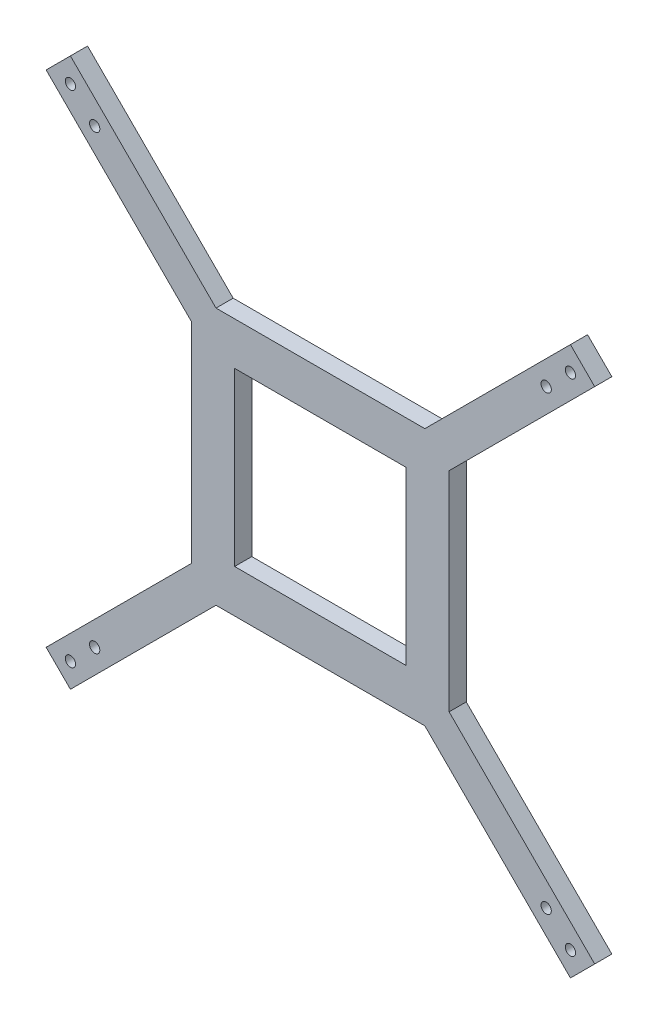
ISO-10303-21;
HEADER;
FILE_DESCRIPTION(('STEP AP214'),'2;1');
FILE_NAME('part.step','',(''),(''),'','','');
FILE_SCHEMA(('AUTOMOTIVE_DESIGN { 1 0 10303 214 1 1 1 1 }'));
ENDSEC;
DATA;
#1=APPLICATION_CONTEXT('core data for automotive mechanical design processes');
#2=APPLICATION_PROTOCOL_DEFINITION('international standard','automotive_design',2000,#1);
#3=PRODUCT_CONTEXT('',#1,'mechanical');
#4=PRODUCT('Part','Part','',(#3));
#5=PRODUCT_RELATED_PRODUCT_CATEGORY('part','',(#4));
#6=PRODUCT_DEFINITION_FORMATION('','',#4);
#7=PRODUCT_DEFINITION_CONTEXT('part definition',#1,'design');
#8=PRODUCT_DEFINITION('design','',#6,#7);
#9=PRODUCT_DEFINITION_SHAPE('','',#8);
#10=(LENGTH_UNIT() NAMED_UNIT(*) SI_UNIT(.MILLI.,.METRE.));
#11=(NAMED_UNIT(*) PLANE_ANGLE_UNIT() SI_UNIT($,.RADIAN.));
#12=(NAMED_UNIT(*) SI_UNIT($,.STERADIAN.) SOLID_ANGLE_UNIT());
#13=UNCERTAINTY_MEASURE_WITH_UNIT(LENGTH_MEASURE(1.E-05),#10,'distance_accuracy_value','');
#14=(GEOMETRIC_REPRESENTATION_CONTEXT(3) GLOBAL_UNCERTAINTY_ASSIGNED_CONTEXT((#13)) GLOBAL_UNIT_ASSIGNED_CONTEXT((#10,
#11,#12)) REPRESENTATION_CONTEXT('',''));
#15=CARTESIAN_POINT('',(0.,0.,0.));
#16=DIRECTION('',(0.,0.,1.));
#17=DIRECTION('',(1.,0.,0.));
#18=AXIS2_PLACEMENT_3D('',#15,#16,#17);
#19=CARTESIAN_POINT('',(0.,0.,5.));
#20=DIRECTION('',(0.,0.,1.));
#21=DIRECTION('',(1.,0.,0.));
#22=AXIS2_PLACEMENT_3D('',#19,#20,#21);
#23=PLANE('',#22);
#24=CARTESIAN_POINT('',(-72.855339059328,-72.8553390593277,5.));
#25=DIRECTION('',(0.,0.,1.));
#26=DIRECTION('',(1.,0.,0.));
#27=AXIS2_PLACEMENT_3D('',#24,#25,#26);
#28=CIRCLE('',#27,1.5);
#29=CARTESIAN_POINT('',(-71.355339059328,-72.8553390593277,5.));
#30=VERTEX_POINT('',#29);
#31=EDGE_CURVE('E668',#30,#30,#28,.T.);
#32=ORIENTED_EDGE('',*,*,#31,.F.);
#33=EDGE_LOOP('',(#32));
#34=FACE_BOUND('',#33,.T.);
#35=CARTESIAN_POINT('',(72.855339059328,-72.8553390593277,5.));
#36=DIRECTION('',(0.,0.,1.));
#37=DIRECTION('',(-1.,0.,0.));
#38=AXIS2_PLACEMENT_3D('',#35,#36,#37);
#39=CIRCLE('',#38,1.5);
#40=CARTESIAN_POINT('',(71.355339059328,-72.8553390593277,5.));
#41=VERTEX_POINT('',#40);
#42=EDGE_CURVE('E680',#41,#41,#39,.T.);
#43=ORIENTED_EDGE('',*,*,#42,.F.);
#44=EDGE_LOOP('',(#43));
#45=FACE_BOUND('',#44,.T.);
#46=CARTESIAN_POINT('',(-65.7842712474625,65.7842712474622,5.));
#47=DIRECTION('',(0.,0.,1.));
#48=DIRECTION('',(-1.,0.,0.));
#49=AXIS2_PLACEMENT_3D('',#46,#47,#48);
#50=CIRCLE('',#49,1.5);
#51=CARTESIAN_POINT('',(-67.2842712474625,65.7842712474622,5.));
#52=VERTEX_POINT('',#51);
#53=EDGE_CURVE('E692',#52,#52,#50,.T.);
#54=ORIENTED_EDGE('',*,*,#53,.F.);
#55=EDGE_LOOP('',(#54));
#56=FACE_BOUND('',#55,.T.);
#57=CARTESIAN_POINT('',(72.855339059328,72.8553390593277,5.));
#58=DIRECTION('',(0.,0.,1.));
#59=DIRECTION('',(1.,0.,0.));
#60=AXIS2_PLACEMENT_3D('',#57,#58,#59);
#61=CIRCLE('',#60,1.5);
#62=CARTESIAN_POINT('',(74.355339059328,72.8553390593277,5.));
#63=VERTEX_POINT('',#62);
#64=EDGE_CURVE('E198',#63,#63,#61,.T.);
#65=ORIENTED_EDGE('',*,*,#64,.F.);
#66=EDGE_LOOP('',(#65));
#67=FACE_BOUND('',#66,.T.);
#68=DIRECTION('',(0.707106781186549,0.707106781186546,0.));
#69=VECTOR('',#68,1.);
#70=CARTESIAN_POINT('',(-72.8553390593272,-79.926406871194,5.));
#71=LINE('',#70,#69);
#72=CARTESIAN_POINT('',(-72.8553390593272,-79.926406871194,5.));
#73=VERTEX_POINT('',#72);
#74=CARTESIAN_POINT('',(-30.4289321881343,-37.5000000000012,5.));
#75=VERTEX_POINT('',#74);
#76=EDGE_CURVE('E208',#73,#75,#71,.T.);
#77=ORIENTED_EDGE('',*,*,#76,.T.);
#78=DIRECTION('',(1.,0.,0.));
#79=VECTOR('',#78,1.);
#80=CARTESIAN_POINT('',(-30.4289321881343,-37.5000000000012,5.));
#81=LINE('',#80,#79);
#82=CARTESIAN_POINT('',(30.4289321881343,-37.5000000000012,5.));
#83=VERTEX_POINT('',#82);
#84=EDGE_CURVE('E211',#75,#83,#81,.T.);
#85=ORIENTED_EDGE('',*,*,#84,.T.);
#86=DIRECTION('',(0.707106781186549,-0.707106781186546,0.));
#87=VECTOR('',#86,1.);
#88=CARTESIAN_POINT('',(72.8553390593272,-79.926406871194,5.));
#89=LINE('',#88,#87);
#90=CARTESIAN_POINT('',(72.8553390593272,-79.926406871194,5.));
#91=VERTEX_POINT('',#90);
#92=EDGE_CURVE('E214',#83,#91,#89,.T.);
#93=ORIENTED_EDGE('',*,*,#92,.T.);
#94=DIRECTION('',(0.707106781186548,0.707106781186548,0.));
#95=VECTOR('',#94,1.);
#96=CARTESIAN_POINT('',(79.9264068711938,-72.8553390593274,5.));
#97=LINE('',#96,#95);
#98=CARTESIAN_POINT('',(79.9264068711938,-72.8553390593274,5.));
#99=VERTEX_POINT('',#98);
#100=EDGE_CURVE('E216',#91,#99,#97,.T.);
#101=ORIENTED_EDGE('',*,*,#100,.T.);
#102=DIRECTION('',(-0.707106781186549,0.707106781186546,0.));
#103=VECTOR('',#102,1.);
#104=CARTESIAN_POINT('',(79.9264068711938,-72.8553390593274,5.));
#105=LINE('',#104,#103);
#106=CARTESIAN_POINT('',(37.5000000000006,-30.4289321881345,5.));
#107=VERTEX_POINT('',#106);
#108=EDGE_CURVE('E218',#99,#107,#105,.T.);
#109=ORIENTED_EDGE('',*,*,#108,.T.);
#110=DIRECTION('',(0.,1.,0.));
#111=VECTOR('',#110,1.);
#112=CARTESIAN_POINT('',(37.5000000000006,30.4289321881345,5.));
#113=LINE('',#112,#111);
#114=CARTESIAN_POINT('',(37.5000000000006,30.4289321881345,5.));
#115=VERTEX_POINT('',#114);
#116=EDGE_CURVE('E220',#107,#115,#113,.T.);
#117=ORIENTED_EDGE('',*,*,#116,.T.);
#118=DIRECTION('',(0.707106781186549,0.707106781186546,0.));
#119=VECTOR('',#118,1.);
#120=CARTESIAN_POINT('',(79.9264068711937,72.8553390593275,5.));
#121=LINE('',#120,#119);
#122=CARTESIAN_POINT('',(79.9264068711937,72.8553390593275,5.));
#123=VERTEX_POINT('',#122);
#124=EDGE_CURVE('E222',#115,#123,#121,.T.);
#125=ORIENTED_EDGE('',*,*,#124,.T.);
#126=DIRECTION('',(-0.707106781186548,0.707106781186548,0.));
#127=VECTOR('',#126,1.);
#128=CARTESIAN_POINT('',(79.9264068711937,72.8553390593275,5.));
#129=LINE('',#128,#127);
#130=CARTESIAN_POINT('',(72.8553390593272,79.926406871194,5.));
#131=VERTEX_POINT('',#130);
#132=EDGE_CURVE('E224',#123,#131,#129,.T.);
#133=ORIENTED_EDGE('',*,*,#132,.T.);
#134=DIRECTION('',(-0.707106781186549,-0.707106781186546,0.));
#135=VECTOR('',#134,1.);
#136=CARTESIAN_POINT('',(72.8553390593272,79.926406871194,5.));
#137=LINE('',#136,#135);
#138=CARTESIAN_POINT('',(30.4289321881343,37.5000000000012,5.));
#139=VERTEX_POINT('',#138);
#140=EDGE_CURVE('E226',#131,#139,#137,.T.);
#141=ORIENTED_EDGE('',*,*,#140,.T.);
#142=DIRECTION('',(-1.,0.,0.));
#143=VECTOR('',#142,1.);
#144=CARTESIAN_POINT('',(-30.4289321881343,37.5000000000012,5.));
#145=LINE('',#144,#143);
#146=CARTESIAN_POINT('',(-30.4289321881343,37.5000000000012,5.));
#147=VERTEX_POINT('',#146);
#148=EDGE_CURVE('E228',#139,#147,#145,.T.);
#149=ORIENTED_EDGE('',*,*,#148,.T.);
#150=DIRECTION('',(-0.707106781186549,0.707106781186546,0.));
#151=VECTOR('',#150,1.);
#152=CARTESIAN_POINT('',(-72.8553390593272,79.926406871194,5.));
#153=LINE('',#152,#151);
#154=CARTESIAN_POINT('',(-72.8553390593272,79.926406871194,5.));
#155=VERTEX_POINT('',#154);
#156=EDGE_CURVE('E230',#147,#155,#153,.T.);
#157=ORIENTED_EDGE('',*,*,#156,.T.);
#158=DIRECTION('',(-0.707106781186548,-0.707106781186548,0.));
#159=VECTOR('',#158,1.);
#160=CARTESIAN_POINT('',(-79.9264068711937,72.8553390593274,5.));
#161=LINE('',#160,#159);
#162=CARTESIAN_POINT('',(-79.9264068711937,72.8553390593274,5.));
#163=VERTEX_POINT('',#162);
#164=EDGE_CURVE('E232',#155,#163,#161,.T.);
#165=ORIENTED_EDGE('',*,*,#164,.T.);
#166=DIRECTION('',(0.707106781186549,-0.707106781186546,0.));
#167=VECTOR('',#166,1.);
#168=CARTESIAN_POINT('',(-79.9264068711937,72.8553390593274,5.));
#169=LINE('',#168,#167);
#170=CARTESIAN_POINT('',(-37.5000000000006,30.4289321881345,5.));
#171=VERTEX_POINT('',#170);
#172=EDGE_CURVE('E234',#163,#171,#169,.T.);
#173=ORIENTED_EDGE('',*,*,#172,.T.);
#174=DIRECTION('',(0.,-1.,0.));
#175=VECTOR('',#174,1.);
#176=CARTESIAN_POINT('',(-37.5000000000006,30.4289321881345,5.));
#177=LINE('',#176,#175);
#178=CARTESIAN_POINT('',(-37.5000000000006,-30.4289321881345,5.));
#179=VERTEX_POINT('',#178);
#180=EDGE_CURVE('E236',#171,#179,#177,.T.);
#181=ORIENTED_EDGE('',*,*,#180,.T.);
#182=DIRECTION('',(-0.707106781186549,-0.707106781186546,0.));
#183=VECTOR('',#182,1.);
#184=CARTESIAN_POINT('',(-79.9264068711937,-72.8553390593274,5.));
#185=LINE('',#184,#183);
#186=CARTESIAN_POINT('',(-79.9264068711937,-72.8553390593274,5.));
#187=VERTEX_POINT('',#186);
#188=EDGE_CURVE('E238',#179,#187,#185,.T.);
#189=ORIENTED_EDGE('',*,*,#188,.T.);
#190=DIRECTION('',(0.707106781186548,-0.707106781186548,0.));
#191=VECTOR('',#190,1.);
#192=CARTESIAN_POINT('',(-79.9264068711937,-72.8553390593274,5.));
#193=LINE('',#192,#191);
#194=EDGE_CURVE('E240',#187,#73,#193,.T.);
#195=ORIENTED_EDGE('',*,*,#194,.T.);
#196=EDGE_LOOP('',(#77,#85,#93,#101,#109,#117,#125,#133,#141,#149,#157,#165,#173,#181,#189,#195));
#197=FACE_BOUND('',#196,.T.);
#198=DIRECTION('',(-1.,0.,0.));
#199=VECTOR('',#198,1.);
#200=CARTESIAN_POINT('',(-25.,25.,5.));
#201=LINE('',#200,#199);
#202=CARTESIAN_POINT('',(24.9999999999994,24.9999999999989,5.));
#203=VERTEX_POINT('',#202);
#204=CARTESIAN_POINT('',(-25.,25.,5.));
#205=VERTEX_POINT('',#204);
#206=EDGE_CURVE('E177',#203,#205,#201,.T.);
#207=ORIENTED_EDGE('',*,*,#206,.F.);
#208=DIRECTION('',(0.,1.,0.));
#209=VECTOR('',#208,1.);
#210=CARTESIAN_POINT('',(24.9999999999994,24.9999999999989,5.));
#211=LINE('',#210,#209);
#212=CARTESIAN_POINT('',(24.9999999999994,-25.0000000000011,5.));
#213=VERTEX_POINT('',#212);
#214=EDGE_CURVE('E169',#213,#203,#211,.T.);
#215=ORIENTED_EDGE('',*,*,#214,.F.);
#216=DIRECTION('',(1.,0.,0.));
#217=VECTOR('',#216,1.);
#218=CARTESIAN_POINT('',(-25.0000000000006,-25.0000000000011,5.));
#219=LINE('',#218,#217);
#220=CARTESIAN_POINT('',(-25.0000000000006,-25.0000000000011,5.));
#221=VERTEX_POINT('',#220);
#222=EDGE_CURVE('E192',#221,#213,#219,.T.);
#223=ORIENTED_EDGE('',*,*,#222,.F.);
#224=DIRECTION('',(0.,-1.,0.));
#225=VECTOR('',#224,1.);
#226=CARTESIAN_POINT('',(-25.,25.,5.));
#227=LINE('',#226,#225);
#228=EDGE_CURVE('E190',#205,#221,#227,.T.);
#229=ORIENTED_EDGE('',*,*,#228,.F.);
#230=EDGE_LOOP('',(#207,#215,#223,#229));
#231=FACE_BOUND('',#230,.T.);
#232=CARTESIAN_POINT('',(65.7842712474625,65.7842712474622,5.));
#233=DIRECTION('',(0.,0.,1.));
#234=DIRECTION('',(1.,0.,0.));
#235=AXIS2_PLACEMENT_3D('',#232,#233,#234);
#236=CIRCLE('',#235,1.5);
#237=CARTESIAN_POINT('',(67.2842712474625,65.7842712474622,5.));
#238=VERTEX_POINT('',#237);
#239=EDGE_CURVE('E698',#238,#238,#236,.T.);
#240=ORIENTED_EDGE('',*,*,#239,.F.);
#241=EDGE_LOOP('',(#240));
#242=FACE_BOUND('',#241,.T.);
#243=CARTESIAN_POINT('',(-72.855339059328,72.8553390593277,5.));
#244=DIRECTION('',(0.,0.,1.));
#245=DIRECTION('',(-1.,0.,0.));
#246=AXIS2_PLACEMENT_3D('',#243,#244,#245);
#247=CIRCLE('',#246,1.5);
#248=CARTESIAN_POINT('',(-74.355339059328,72.8553390593277,5.));
#249=VERTEX_POINT('',#248);
#250=EDGE_CURVE('E686',#249,#249,#247,.T.);
#251=ORIENTED_EDGE('',*,*,#250,.F.);
#252=EDGE_LOOP('',(#251));
#253=FACE_BOUND('',#252,.T.);
#254=CARTESIAN_POINT('',(65.7842712474625,-65.7842712474622,5.));
#255=DIRECTION('',(0.,0.,1.));
#256=DIRECTION('',(-1.,0.,0.));
#257=AXIS2_PLACEMENT_3D('',#254,#255,#256);
#258=CIRCLE('',#257,1.5);
#259=CARTESIAN_POINT('',(64.2842712474625,-65.7842712474622,5.));
#260=VERTEX_POINT('',#259);
#261=EDGE_CURVE('E674',#260,#260,#258,.T.);
#262=ORIENTED_EDGE('',*,*,#261,.F.);
#263=EDGE_LOOP('',(#262));
#264=FACE_BOUND('',#263,.T.);
#265=CARTESIAN_POINT('',(-65.7842712474625,-65.7842712474623,5.));
#266=DIRECTION('',(0.,0.,1.));
#267=DIRECTION('',(1.,0.,0.));
#268=AXIS2_PLACEMENT_3D('',#265,#266,#267);
#269=CIRCLE('',#268,1.5);
#270=CARTESIAN_POINT('',(-64.2842712474625,-65.7842712474623,5.));
#271=VERTEX_POINT('',#270);
#272=EDGE_CURVE('E659',#271,#271,#269,.T.);
#273=ORIENTED_EDGE('',*,*,#272,.F.);
#274=EDGE_LOOP('',(#273));
#275=FACE_BOUND('',#274,.T.);
#276=ADVANCED_FACE('F32',(#34,#45,#56,#67,#197,#231,#242,#253,#264,#275),#23,.T.);
#277=CARTESIAN_POINT('',(0.,0.,0.));
#278=DIRECTION('',(0.,0.,1.));
#279=DIRECTION('',(1.,0.,0.));
#280=AXIS2_PLACEMENT_3D('',#277,#278,#279);
#281=PLANE('',#280);
#282=DIRECTION('',(0.707106781186549,0.707106781186546,0.));
#283=VECTOR('',#282,1.);
#284=CARTESIAN_POINT('',(-72.8553390593272,-79.926406871194,0.));
#285=LINE('',#284,#283);
#286=CARTESIAN_POINT('',(-72.8553390593272,-79.926406871194,0.));
#287=VERTEX_POINT('',#286);
#288=CARTESIAN_POINT('',(-30.4289321881343,-37.5000000000012,0.));
#289=VERTEX_POINT('',#288);
#290=EDGE_CURVE('E185',#287,#289,#285,.T.);
#291=ORIENTED_EDGE('',*,*,#290,.F.);
#292=DIRECTION('',(0.707106781186548,-0.707106781186548,0.));
#293=VECTOR('',#292,1.);
#294=CARTESIAN_POINT('',(-79.9264068711937,-72.8553390593274,0.));
#295=LINE('',#294,#293);
#296=CARTESIAN_POINT('',(-79.9264068711937,-72.8553390593274,0.));
#297=VERTEX_POINT('',#296);
#298=EDGE_CURVE('E212',#297,#287,#295,.T.);
#299=ORIENTED_EDGE('',*,*,#298,.F.);
#300=DIRECTION('',(-0.707106781186549,-0.707106781186546,0.));
#301=VECTOR('',#300,1.);
#302=CARTESIAN_POINT('',(-79.9264068711937,-72.8553390593274,0.));
#303=LINE('',#302,#301);
#304=CARTESIAN_POINT('',(-37.5000000000006,-30.4289321881345,0.));
#305=VERTEX_POINT('',#304);
#306=EDGE_CURVE('E271',#305,#297,#303,.T.);
#307=ORIENTED_EDGE('',*,*,#306,.F.);
#308=DIRECTION('',(0.,-1.,0.));
#309=VECTOR('',#308,1.);
#310=CARTESIAN_POINT('',(-37.5000000000006,30.4289321881345,0.));
#311=LINE('',#310,#309);
#312=CARTESIAN_POINT('',(-37.5000000000006,30.4289321881345,0.));
#313=VERTEX_POINT('',#312);
#314=EDGE_CURVE('E269',#313,#305,#311,.T.);
#315=ORIENTED_EDGE('',*,*,#314,.F.);
#316=DIRECTION('',(0.707106781186549,-0.707106781186546,0.));
#317=VECTOR('',#316,1.);
#318=CARTESIAN_POINT('',(-79.9264068711937,72.8553390593274,0.));
#319=LINE('',#318,#317);
#320=CARTESIAN_POINT('',(-79.9264068711937,72.8553390593274,0.));
#321=VERTEX_POINT('',#320);
#322=EDGE_CURVE('E267',#321,#313,#319,.T.);
#323=ORIENTED_EDGE('',*,*,#322,.F.);
#324=DIRECTION('',(-0.707106781186548,-0.707106781186548,0.));
#325=VECTOR('',#324,1.);
#326=CARTESIAN_POINT('',(-79.9264068711937,72.8553390593274,0.));
#327=LINE('',#326,#325);
#328=CARTESIAN_POINT('',(-72.8553390593272,79.926406871194,0.));
#329=VERTEX_POINT('',#328);
#330=EDGE_CURVE('E265',#329,#321,#327,.T.);
#331=ORIENTED_EDGE('',*,*,#330,.F.);
#332=DIRECTION('',(-0.707106781186549,0.707106781186546,0.));
#333=VECTOR('',#332,1.);
#334=CARTESIAN_POINT('',(-72.8553390593272,79.926406871194,0.));
#335=LINE('',#334,#333);
#336=CARTESIAN_POINT('',(-30.4289321881343,37.5000000000012,0.));
#337=VERTEX_POINT('',#336);
#338=EDGE_CURVE('E263',#337,#329,#335,.T.);
#339=ORIENTED_EDGE('',*,*,#338,.F.);
#340=DIRECTION('',(-1.,0.,0.));
#341=VECTOR('',#340,1.);
#342=CARTESIAN_POINT('',(-30.4289321881343,37.5000000000012,0.));
#343=LINE('',#342,#341);
#344=CARTESIAN_POINT('',(30.4289321881343,37.5000000000012,0.));
#345=VERTEX_POINT('',#344);
#346=EDGE_CURVE('E261',#345,#337,#343,.T.);
#347=ORIENTED_EDGE('',*,*,#346,.F.);
#348=DIRECTION('',(-0.707106781186549,-0.707106781186546,0.));
#349=VECTOR('',#348,1.);
#350=CARTESIAN_POINT('',(72.8553390593272,79.926406871194,0.));
#351=LINE('',#350,#349);
#352=CARTESIAN_POINT('',(72.8553390593272,79.926406871194,0.));
#353=VERTEX_POINT('',#352);
#354=EDGE_CURVE('E259',#353,#345,#351,.T.);
#355=ORIENTED_EDGE('',*,*,#354,.F.);
#356=DIRECTION('',(-0.707106781186548,0.707106781186548,0.));
#357=VECTOR('',#356,1.);
#358=CARTESIAN_POINT('',(79.9264068711937,72.8553390593275,0.));
#359=LINE('',#358,#357);
#360=CARTESIAN_POINT('',(79.9264068711937,72.8553390593275,0.));
#361=VERTEX_POINT('',#360);
#362=EDGE_CURVE('E257',#361,#353,#359,.T.);
#363=ORIENTED_EDGE('',*,*,#362,.F.);
#364=DIRECTION('',(0.707106781186549,0.707106781186546,0.));
#365=VECTOR('',#364,1.);
#366=CARTESIAN_POINT('',(79.9264068711937,72.8553390593275,0.));
#367=LINE('',#366,#365);
#368=CARTESIAN_POINT('',(37.5000000000006,30.4289321881345,0.));
#369=VERTEX_POINT('',#368);
#370=EDGE_CURVE('E255',#369,#361,#367,.T.);
#371=ORIENTED_EDGE('',*,*,#370,.F.);
#372=DIRECTION('',(0.,1.,0.));
#373=VECTOR('',#372,1.);
#374=CARTESIAN_POINT('',(37.5000000000006,30.4289321881345,0.));
#375=LINE('',#374,#373);
#376=CARTESIAN_POINT('',(37.5000000000006,-30.4289321881345,0.));
#377=VERTEX_POINT('',#376);
#378=EDGE_CURVE('E253',#377,#369,#375,.T.);
#379=ORIENTED_EDGE('',*,*,#378,.F.);
#380=DIRECTION('',(-0.707106781186549,0.707106781186546,0.));
#381=VECTOR('',#380,1.);
#382=CARTESIAN_POINT('',(79.9264068711938,-72.8553390593274,0.));
#383=LINE('',#382,#381);
#384=CARTESIAN_POINT('',(79.9264068711938,-72.8553390593274,0.));
#385=VERTEX_POINT('',#384);
#386=EDGE_CURVE('E251',#385,#377,#383,.T.);
#387=ORIENTED_EDGE('',*,*,#386,.F.);
#388=DIRECTION('',(0.707106781186548,0.707106781186548,0.));
#389=VECTOR('',#388,1.);
#390=CARTESIAN_POINT('',(79.9264068711938,-72.8553390593274,0.));
#391=LINE('',#390,#389);
#392=CARTESIAN_POINT('',(72.8553390593272,-79.926406871194,0.));
#393=VERTEX_POINT('',#392);
#394=EDGE_CURVE('E249',#393,#385,#391,.T.);
#395=ORIENTED_EDGE('',*,*,#394,.F.);
#396=DIRECTION('',(0.707106781186549,-0.707106781186546,0.));
#397=VECTOR('',#396,1.);
#398=CARTESIAN_POINT('',(72.8553390593272,-79.926406871194,0.));
#399=LINE('',#398,#397);
#400=CARTESIAN_POINT('',(30.4289321881343,-37.5000000000012,0.));
#401=VERTEX_POINT('',#400);
#402=EDGE_CURVE('E247',#401,#393,#399,.T.);
#403=ORIENTED_EDGE('',*,*,#402,.F.);
#404=DIRECTION('',(1.,0.,0.));
#405=VECTOR('',#404,1.);
#406=CARTESIAN_POINT('',(-30.4289321881343,-37.5000000000012,0.));
#407=LINE('',#406,#405);
#408=EDGE_CURVE('E245',#289,#401,#407,.T.);
#409=ORIENTED_EDGE('',*,*,#408,.F.);
#410=EDGE_LOOP('',(#291,#299,#307,#315,#323,#331,#339,#347,#355,#363,#371,#379,#387,#395,#403,#409));
#411=FACE_BOUND('',#410,.T.);
#412=DIRECTION('',(0.,1.,0.));
#413=VECTOR('',#412,1.);
#414=CARTESIAN_POINT('',(24.9999999999994,24.9999999999989,0.));
#415=LINE('',#414,#413);
#416=CARTESIAN_POINT('',(24.9999999999994,-25.0000000000011,0.));
#417=VERTEX_POINT('',#416);
#418=CARTESIAN_POINT('',(24.9999999999994,24.9999999999989,0.));
#419=VERTEX_POINT('',#418);
#420=EDGE_CURVE('E55',#417,#419,#415,.T.);
#421=ORIENTED_EDGE('',*,*,#420,.T.);
#422=DIRECTION('',(-1.,0.,0.));
#423=VECTOR('',#422,1.);
#424=CARTESIAN_POINT('',(-25.,25.,0.));
#425=LINE('',#424,#423);
#426=CARTESIAN_POINT('',(-25.,25.,0.));
#427=VERTEX_POINT('',#426);
#428=EDGE_CURVE('E184',#419,#427,#425,.T.);
#429=ORIENTED_EDGE('',*,*,#428,.T.);
#430=DIRECTION('',(0.,-1.,0.));
#431=VECTOR('',#430,1.);
#432=CARTESIAN_POINT('',(-25.,25.,0.));
#433=LINE('',#432,#431);
#434=CARTESIAN_POINT('',(-25.0000000000006,-25.0000000000011,0.));
#435=VERTEX_POINT('',#434);
#436=EDGE_CURVE('E200',#427,#435,#433,.T.);
#437=ORIENTED_EDGE('',*,*,#436,.T.);
#438=DIRECTION('',(1.,0.,0.));
#439=VECTOR('',#438,1.);
#440=CARTESIAN_POINT('',(-25.0000000000006,-25.0000000000011,0.));
#441=LINE('',#440,#439);
#442=EDGE_CURVE('E178',#435,#417,#441,.T.);
#443=ORIENTED_EDGE('',*,*,#442,.T.);
#444=EDGE_LOOP('',(#421,#429,#437,#443));
#445=FACE_BOUND('',#444,.T.);
#446=CARTESIAN_POINT('',(72.855339059328,72.8553390593277,0.));
#447=DIRECTION('',(0.,0.,1.));
#448=DIRECTION('',(1.,0.,0.));
#449=AXIS2_PLACEMENT_3D('',#446,#447,#448);
#450=CIRCLE('',#449,1.5);
#451=CARTESIAN_POINT('',(74.355339059328,72.8553390593277,0.));
#452=VERTEX_POINT('',#451);
#453=EDGE_CURVE('E701',#452,#452,#450,.T.);
#454=ORIENTED_EDGE('',*,*,#453,.T.);
#455=EDGE_LOOP('',(#454));
#456=FACE_BOUND('',#455,.T.);
#457=CARTESIAN_POINT('',(65.7842712474625,65.7842712474622,0.));
#458=DIRECTION('',(0.,0.,1.));
#459=DIRECTION('',(1.,0.,0.));
#460=AXIS2_PLACEMENT_3D('',#457,#458,#459);
#461=CIRCLE('',#460,1.5);
#462=CARTESIAN_POINT('',(67.2842712474625,65.7842712474622,0.));
#463=VERTEX_POINT('',#462);
#464=EDGE_CURVE('E695',#463,#463,#461,.T.);
#465=ORIENTED_EDGE('',*,*,#464,.T.);
#466=EDGE_LOOP('',(#465));
#467=FACE_BOUND('',#466,.T.);
#468=CARTESIAN_POINT('',(-65.7842712474625,65.7842712474622,0.));
#469=DIRECTION('',(0.,0.,1.));
#470=DIRECTION('',(-1.,0.,0.));
#471=AXIS2_PLACEMENT_3D('',#468,#469,#470);
#472=CIRCLE('',#471,1.5);
#473=CARTESIAN_POINT('',(-67.2842712474625,65.7842712474622,0.));
#474=VERTEX_POINT('',#473);
#475=EDGE_CURVE('E689',#474,#474,#472,.T.);
#476=ORIENTED_EDGE('',*,*,#475,.T.);
#477=EDGE_LOOP('',(#476));
#478=FACE_BOUND('',#477,.T.);
#479=CARTESIAN_POINT('',(-72.855339059328,72.8553390593277,0.));
#480=DIRECTION('',(0.,0.,1.));
#481=DIRECTION('',(-1.,0.,0.));
#482=AXIS2_PLACEMENT_3D('',#479,#480,#481);
#483=CIRCLE('',#482,1.5);
#484=CARTESIAN_POINT('',(-74.355339059328,72.8553390593277,0.));
#485=VERTEX_POINT('',#484);
#486=EDGE_CURVE('E683',#485,#485,#483,.T.);
#487=ORIENTED_EDGE('',*,*,#486,.T.);
#488=EDGE_LOOP('',(#487));
#489=FACE_BOUND('',#488,.T.);
#490=CARTESIAN_POINT('',(72.855339059328,-72.8553390593277,0.));
#491=DIRECTION('',(0.,0.,1.));
#492=DIRECTION('',(-1.,0.,0.));
#493=AXIS2_PLACEMENT_3D('',#490,#491,#492);
#494=CIRCLE('',#493,1.5);
#495=CARTESIAN_POINT('',(71.355339059328,-72.8553390593277,0.));
#496=VERTEX_POINT('',#495);
#497=EDGE_CURVE('E677',#496,#496,#494,.T.);
#498=ORIENTED_EDGE('',*,*,#497,.T.);
#499=EDGE_LOOP('',(#498));
#500=FACE_BOUND('',#499,.T.);
#501=CARTESIAN_POINT('',(65.7842712474625,-65.7842712474622,0.));
#502=DIRECTION('',(0.,0.,1.));
#503=DIRECTION('',(-1.,0.,0.));
#504=AXIS2_PLACEMENT_3D('',#501,#502,#503);
#505=CIRCLE('',#504,1.5);
#506=CARTESIAN_POINT('',(64.2842712474625,-65.7842712474622,0.));
#507=VERTEX_POINT('',#506);
#508=EDGE_CURVE('E671',#507,#507,#505,.T.);
#509=ORIENTED_EDGE('',*,*,#508,.T.);
#510=EDGE_LOOP('',(#509));
#511=FACE_BOUND('',#510,.T.);
#512=CARTESIAN_POINT('',(-72.855339059328,-72.8553390593277,0.));
#513=DIRECTION('',(0.,0.,1.));
#514=DIRECTION('',(1.,0.,0.));
#515=AXIS2_PLACEMENT_3D('',#512,#513,#514);
#516=CIRCLE('',#515,1.5);
#517=CARTESIAN_POINT('',(-71.355339059328,-72.8553390593277,0.));
#518=VERTEX_POINT('',#517);
#519=EDGE_CURVE('E665',#518,#518,#516,.T.);
#520=ORIENTED_EDGE('',*,*,#519,.T.);
#521=EDGE_LOOP('',(#520));
#522=FACE_BOUND('',#521,.T.);
#523=CARTESIAN_POINT('',(-65.7842712474625,-65.7842712474623,0.));
#524=DIRECTION('',(0.,0.,1.));
#525=DIRECTION('',(1.,0.,0.));
#526=AXIS2_PLACEMENT_3D('',#523,#524,#525);
#527=CIRCLE('',#526,1.5);
#528=CARTESIAN_POINT('',(-64.2842712474625,-65.7842712474623,0.));
#529=VERTEX_POINT('',#528);
#530=EDGE_CURVE('E662',#529,#529,#527,.T.);
#531=ORIENTED_EDGE('',*,*,#530,.T.);
#532=EDGE_LOOP('',(#531));
#533=FACE_BOUND('',#532,.T.);
#534=ADVANCED_FACE('F325',(#411,#445,#456,#467,#478,#489,#500,#511,#522,#533),#281,.F.);
#535=CARTESIAN_POINT('',(-72.8553390593272,-79.926406871194,5.));
#536=DIRECTION('',(-0.707106781186546,0.707106781186549,0.));
#537=DIRECTION('',(-0.707106781186549,-0.707106781186546,0.));
#538=AXIS2_PLACEMENT_3D('',#535,#536,#537);
#539=PLANE('',#538);
#540=ORIENTED_EDGE('',*,*,#290,.T.);
#541=DIRECTION('',(0.,0.,-1.));
#542=VECTOR('',#541,1.);
#543=CARTESIAN_POINT('',(-30.4289321881343,-37.5000000000012,5.));
#544=LINE('',#543,#542);
#545=EDGE_CURVE('E11',#75,#289,#544,.T.);
#546=ORIENTED_EDGE('',*,*,#545,.F.);
#547=ORIENTED_EDGE('',*,*,#76,.F.);
#548=DIRECTION('',(0.,0.,-1.));
#549=VECTOR('',#548,1.);
#550=CARTESIAN_POINT('',(-72.8553390593272,-79.926406871194,5.));
#551=LINE('',#550,#549);
#552=EDGE_CURVE('E242',#73,#287,#551,.T.);
#553=ORIENTED_EDGE('',*,*,#552,.T.);
#554=EDGE_LOOP('',(#540,#546,#547,#553));
#555=FACE_BOUND('',#554,.T.);
#556=ADVANCED_FACE('F34',(#555),#539,.F.);
#557=CARTESIAN_POINT('',(-30.4289321881343,-37.5000000000012,5.));
#558=DIRECTION('',(0.,1.,0.));
#559=DIRECTION('',(0.,0.,1.));
#560=AXIS2_PLACEMENT_3D('',#557,#558,#559);
#561=PLANE('',#560);
#562=ORIENTED_EDGE('',*,*,#408,.T.);
#563=DIRECTION('',(0.,0.,-1.));
#564=VECTOR('',#563,1.);
#565=CARTESIAN_POINT('',(30.4289321881343,-37.5000000000012,5.));
#566=LINE('',#565,#564);
#567=EDGE_CURVE('E40',#83,#401,#566,.T.);
#568=ORIENTED_EDGE('',*,*,#567,.F.);
#569=ORIENTED_EDGE('',*,*,#84,.F.);
#570=ORIENTED_EDGE('',*,*,#545,.T.);
#571=EDGE_LOOP('',(#562,#568,#569,#570));
#572=FACE_BOUND('',#571,.T.);
#573=ADVANCED_FACE('F342',(#572),#561,.F.);
#574=CARTESIAN_POINT('',(72.8553390593272,-79.926406871194,5.));
#575=DIRECTION('',(0.707106781186546,0.707106781186549,0.));
#576=DIRECTION('',(-0.707106781186549,0.707106781186546,0.));
#577=AXIS2_PLACEMENT_3D('',#574,#575,#576);
#578=PLANE('',#577);
#579=ORIENTED_EDGE('',*,*,#402,.T.);
#580=DIRECTION('',(0.,0.,-1.));
#581=VECTOR('',#580,1.);
#582=CARTESIAN_POINT('',(72.8553390593272,-79.926406871194,5.));
#583=LINE('',#582,#581);
#584=EDGE_CURVE('E312',#91,#393,#583,.T.);
#585=ORIENTED_EDGE('',*,*,#584,.F.);
#586=ORIENTED_EDGE('',*,*,#92,.F.);
#587=ORIENTED_EDGE('',*,*,#567,.T.);
#588=EDGE_LOOP('',(#579,#585,#586,#587));
#589=FACE_BOUND('',#588,.T.);
#590=ADVANCED_FACE('F319',(#589),#578,.F.);
#591=CARTESIAN_POINT('',(79.9264068711938,-72.8553390593274,5.));
#592=DIRECTION('',(-0.707106781186548,0.707106781186548,0.));
#593=DIRECTION('',(-0.707106781186548,-0.707106781186548,0.));
#594=AXIS2_PLACEMENT_3D('',#591,#592,#593);
#595=PLANE('',#594);
#596=ORIENTED_EDGE('',*,*,#394,.T.);
#597=DIRECTION('',(0.,0.,-1.));
#598=VECTOR('',#597,1.);
#599=CARTESIAN_POINT('',(79.9264068711938,-72.8553390593274,5.));
#600=LINE('',#599,#598);
#601=EDGE_CURVE('E309',#99,#385,#600,.T.);
#602=ORIENTED_EDGE('',*,*,#601,.F.);
#603=ORIENTED_EDGE('',*,*,#100,.F.);
#604=ORIENTED_EDGE('',*,*,#584,.T.);
#605=EDGE_LOOP('',(#596,#602,#603,#604));
#606=FACE_BOUND('',#605,.T.);
#607=ADVANCED_FACE('F331',(#606),#595,.F.);
#608=CARTESIAN_POINT('',(79.9264068711938,-72.8553390593274,5.));
#609=DIRECTION('',(-0.707106781186546,-0.707106781186549,0.));
#610=DIRECTION('',(0.707106781186549,-0.707106781186546,0.));
#611=AXIS2_PLACEMENT_3D('',#608,#609,#610);
#612=PLANE('',#611);
#613=ORIENTED_EDGE('',*,*,#386,.T.);
#614=DIRECTION('',(0.,0.,-1.));
#615=VECTOR('',#614,1.);
#616=CARTESIAN_POINT('',(37.5000000000006,-30.4289321881345,5.));
#617=LINE('',#616,#615);
#618=EDGE_CURVE('E306',#107,#377,#617,.T.);
#619=ORIENTED_EDGE('',*,*,#618,.F.);
#620=ORIENTED_EDGE('',*,*,#108,.F.);
#621=ORIENTED_EDGE('',*,*,#601,.T.);
#622=EDGE_LOOP('',(#613,#619,#620,#621));
#623=FACE_BOUND('',#622,.T.);
#624=ADVANCED_FACE('F335',(#623),#612,.F.);
#625=CARTESIAN_POINT('',(37.5000000000006,30.4289321881345,5.));
#626=DIRECTION('',(-1.,0.,0.));
#627=DIRECTION('',(0.,0.,1.));
#628=AXIS2_PLACEMENT_3D('',#625,#626,#627);
#629=PLANE('',#628);
#630=ORIENTED_EDGE('',*,*,#378,.T.);
#631=DIRECTION('',(0.,0.,-1.));
#632=VECTOR('',#631,1.);
#633=CARTESIAN_POINT('',(37.5000000000006,30.4289321881345,5.));
#634=LINE('',#633,#632);
#635=EDGE_CURVE('E303',#115,#369,#634,.T.);
#636=ORIENTED_EDGE('',*,*,#635,.F.);
#637=ORIENTED_EDGE('',*,*,#116,.F.);
#638=ORIENTED_EDGE('',*,*,#618,.T.);
#639=EDGE_LOOP('',(#630,#636,#637,#638));
#640=FACE_BOUND('',#639,.T.);
#641=ADVANCED_FACE('F395',(#640),#629,.F.);
#642=CARTESIAN_POINT('',(79.9264068711937,72.8553390593275,5.));
#643=DIRECTION('',(-0.707106781186546,0.707106781186549,0.));
#644=DIRECTION('',(-0.707106781186549,-0.707106781186546,0.));
#645=AXIS2_PLACEMENT_3D('',#642,#643,#644);
#646=PLANE('',#645);
#647=ORIENTED_EDGE('',*,*,#370,.T.);
#648=DIRECTION('',(0.,0.,-1.));
#649=VECTOR('',#648,1.);
#650=CARTESIAN_POINT('',(79.9264068711937,72.8553390593275,5.));
#651=LINE('',#650,#649);
#652=EDGE_CURVE('E300',#123,#361,#651,.T.);
#653=ORIENTED_EDGE('',*,*,#652,.F.);
#654=ORIENTED_EDGE('',*,*,#124,.F.);
#655=ORIENTED_EDGE('',*,*,#635,.T.);
#656=EDGE_LOOP('',(#647,#653,#654,#655));
#657=FACE_BOUND('',#656,.T.);
#658=ADVANCED_FACE('F392',(#657),#646,.F.);
#659=CARTESIAN_POINT('',(79.9264068711937,72.8553390593275,5.));
#660=DIRECTION('',(-0.707106781186548,-0.707106781186548,0.));
#661=DIRECTION('',(0.707106781186548,-0.707106781186548,0.));
#662=AXIS2_PLACEMENT_3D('',#659,#660,#661);
#663=PLANE('',#662);
#664=ORIENTED_EDGE('',*,*,#362,.T.);
#665=DIRECTION('',(0.,0.,-1.));
#666=VECTOR('',#665,1.);
#667=CARTESIAN_POINT('',(72.8553390593272,79.926406871194,5.));
#668=LINE('',#667,#666);
#669=EDGE_CURVE('E297',#131,#353,#668,.T.);
#670=ORIENTED_EDGE('',*,*,#669,.F.);
#671=ORIENTED_EDGE('',*,*,#132,.F.);
#672=ORIENTED_EDGE('',*,*,#652,.T.);
#673=EDGE_LOOP('',(#664,#670,#671,#672));
#674=FACE_BOUND('',#673,.T.);
#675=ADVANCED_FACE('F388',(#674),#663,.F.);
#676=CARTESIAN_POINT('',(72.8553390593272,79.926406871194,5.));
#677=DIRECTION('',(0.707106781186546,-0.707106781186549,0.));
#678=DIRECTION('',(0.707106781186549,0.707106781186546,0.));
#679=AXIS2_PLACEMENT_3D('',#676,#677,#678);
#680=PLANE('',#679);
#681=ORIENTED_EDGE('',*,*,#354,.T.);
#682=DIRECTION('',(0.,0.,-1.));
#683=VECTOR('',#682,1.);
#684=CARTESIAN_POINT('',(30.4289321881343,37.5000000000012,5.));
#685=LINE('',#684,#683);
#686=EDGE_CURVE('E294',#139,#345,#685,.T.);
#687=ORIENTED_EDGE('',*,*,#686,.F.);
#688=ORIENTED_EDGE('',*,*,#140,.F.);
#689=ORIENTED_EDGE('',*,*,#669,.T.);
#690=EDGE_LOOP('',(#681,#687,#688,#689));
#691=FACE_BOUND('',#690,.T.);
#692=ADVANCED_FACE('F384',(#691),#680,.F.);
#693=CARTESIAN_POINT('',(-30.4289321881343,37.5000000000012,5.));
#694=DIRECTION('',(0.,-1.,0.));
#695=DIRECTION('',(0.,0.,-1.));
#696=AXIS2_PLACEMENT_3D('',#693,#694,#695);
#697=PLANE('',#696);
#698=ORIENTED_EDGE('',*,*,#346,.T.);
#699=DIRECTION('',(0.,0.,-1.));
#700=VECTOR('',#699,1.);
#701=CARTESIAN_POINT('',(-30.4289321881343,37.5000000000012,5.));
#702=LINE('',#701,#700);
#703=EDGE_CURVE('E291',#147,#337,#702,.T.);
#704=ORIENTED_EDGE('',*,*,#703,.F.);
#705=ORIENTED_EDGE('',*,*,#148,.F.);
#706=ORIENTED_EDGE('',*,*,#686,.T.);
#707=EDGE_LOOP('',(#698,#704,#705,#706));
#708=FACE_BOUND('',#707,.T.);
#709=ADVANCED_FACE('F379',(#708),#697,.F.);
#710=CARTESIAN_POINT('',(-72.8553390593272,79.926406871194,5.));
#711=DIRECTION('',(-0.707106781186546,-0.707106781186549,0.));
#712=DIRECTION('',(0.707106781186549,-0.707106781186546,0.));
#713=AXIS2_PLACEMENT_3D('',#710,#711,#712);
#714=PLANE('',#713);
#715=ORIENTED_EDGE('',*,*,#338,.T.);
#716=DIRECTION('',(0.,0.,-1.));
#717=VECTOR('',#716,1.);
#718=CARTESIAN_POINT('',(-72.8553390593272,79.926406871194,5.));
#719=LINE('',#718,#717);
#720=EDGE_CURVE('E288',#155,#329,#719,.T.);
#721=ORIENTED_EDGE('',*,*,#720,.F.);
#722=ORIENTED_EDGE('',*,*,#156,.F.);
#723=ORIENTED_EDGE('',*,*,#703,.T.);
#724=EDGE_LOOP('',(#715,#721,#722,#723));
#725=FACE_BOUND('',#724,.T.);
#726=ADVANCED_FACE('F373',(#725),#714,.F.);
#727=CARTESIAN_POINT('',(-79.9264068711937,72.8553390593274,5.));
#728=DIRECTION('',(0.707106781186548,-0.707106781186548,0.));
#729=DIRECTION('',(0.707106781186548,0.707106781186548,0.));
#730=AXIS2_PLACEMENT_3D('',#727,#728,#729);
#731=PLANE('',#730);
#732=ORIENTED_EDGE('',*,*,#330,.T.);
#733=DIRECTION('',(0.,0.,-1.));
#734=VECTOR('',#733,1.);
#735=CARTESIAN_POINT('',(-79.9264068711937,72.8553390593274,5.));
#736=LINE('',#735,#734);
#737=EDGE_CURVE('E285',#163,#321,#736,.T.);
#738=ORIENTED_EDGE('',*,*,#737,.F.);
#739=ORIENTED_EDGE('',*,*,#164,.F.);
#740=ORIENTED_EDGE('',*,*,#720,.T.);
#741=EDGE_LOOP('',(#732,#738,#739,#740));
#742=FACE_BOUND('',#741,.T.);
#743=ADVANCED_FACE('F369',(#742),#731,.F.);
#744=CARTESIAN_POINT('',(-79.9264068711937,72.8553390593274,5.));
#745=DIRECTION('',(0.707106781186546,0.707106781186549,0.));
#746=DIRECTION('',(-0.707106781186549,0.707106781186546,0.));
#747=AXIS2_PLACEMENT_3D('',#744,#745,#746);
#748=PLANE('',#747);
#749=ORIENTED_EDGE('',*,*,#322,.T.);
#750=DIRECTION('',(0.,0.,-1.));
#751=VECTOR('',#750,1.);
#752=CARTESIAN_POINT('',(-37.5000000000006,30.4289321881345,5.));
#753=LINE('',#752,#751);
#754=EDGE_CURVE('E282',#171,#313,#753,.T.);
#755=ORIENTED_EDGE('',*,*,#754,.F.);
#756=ORIENTED_EDGE('',*,*,#172,.F.);
#757=ORIENTED_EDGE('',*,*,#737,.T.);
#758=EDGE_LOOP('',(#749,#755,#756,#757));
#759=FACE_BOUND('',#758,.T.);
#760=ADVANCED_FACE('F364',(#759),#748,.F.);
#761=CARTESIAN_POINT('',(-37.5000000000006,30.4289321881345,5.));
#762=DIRECTION('',(1.,0.,0.));
#763=DIRECTION('',(0.,0.,-1.));
#764=AXIS2_PLACEMENT_3D('',#761,#762,#763);
#765=PLANE('',#764);
#766=ORIENTED_EDGE('',*,*,#314,.T.);
#767=DIRECTION('',(0.,0.,-1.));
#768=VECTOR('',#767,1.);
#769=CARTESIAN_POINT('',(-37.5000000000006,-30.4289321881345,5.));
#770=LINE('',#769,#768);
#771=EDGE_CURVE('E279',#179,#305,#770,.T.);
#772=ORIENTED_EDGE('',*,*,#771,.F.);
#773=ORIENTED_EDGE('',*,*,#180,.F.);
#774=ORIENTED_EDGE('',*,*,#754,.T.);
#775=EDGE_LOOP('',(#766,#772,#773,#774));
#776=FACE_BOUND('',#775,.T.);
#777=ADVANCED_FACE('F358',(#776),#765,.F.);
#778=CARTESIAN_POINT('',(-79.9264068711937,-72.8553390593274,5.));
#779=DIRECTION('',(0.707106781186546,-0.707106781186549,0.));
#780=DIRECTION('',(0.707106781186549,0.707106781186546,0.));
#781=AXIS2_PLACEMENT_3D('',#778,#779,#780);
#782=PLANE('',#781);
#783=ORIENTED_EDGE('',*,*,#306,.T.);
#784=DIRECTION('',(0.,0.,-1.));
#785=VECTOR('',#784,1.);
#786=CARTESIAN_POINT('',(-79.9264068711937,-72.8553390593274,5.));
#787=LINE('',#786,#785);
#788=EDGE_CURVE('E276',#187,#297,#787,.T.);
#789=ORIENTED_EDGE('',*,*,#788,.F.);
#790=ORIENTED_EDGE('',*,*,#188,.F.);
#791=ORIENTED_EDGE('',*,*,#771,.T.);
#792=EDGE_LOOP('',(#783,#789,#790,#791));
#793=FACE_BOUND('',#792,.T.);
#794=ADVANCED_FACE('F354',(#793),#782,.F.);
#795=CARTESIAN_POINT('',(-79.9264068711937,-72.8553390593274,5.));
#796=DIRECTION('',(0.707106781186548,0.707106781186548,0.));
#797=DIRECTION('',(-0.707106781186548,0.707106781186548,0.));
#798=AXIS2_PLACEMENT_3D('',#795,#796,#797);
#799=PLANE('',#798);
#800=ORIENTED_EDGE('',*,*,#298,.T.);
#801=ORIENTED_EDGE('',*,*,#552,.F.);
#802=ORIENTED_EDGE('',*,*,#194,.F.);
#803=ORIENTED_EDGE('',*,*,#788,.T.);
#804=EDGE_LOOP('',(#800,#801,#802,#803));
#805=FACE_BOUND('',#804,.T.);
#806=ADVANCED_FACE('F349',(#805),#799,.F.);
#807=CARTESIAN_POINT('',(24.9999999999994,24.9999999999989,5.));
#808=DIRECTION('',(-1.,0.,0.));
#809=DIRECTION('',(0.,-1.,0.));
#810=AXIS2_PLACEMENT_3D('',#807,#808,#809);
#811=PLANE('',#810);
#812=ORIENTED_EDGE('',*,*,#420,.F.);
#813=DIRECTION('',(0.,0.,-1.));
#814=VECTOR('',#813,1.);
#815=CARTESIAN_POINT('',(24.9999999999994,-25.0000000000011,5.));
#816=LINE('',#815,#814);
#817=EDGE_CURVE('E173',#213,#417,#816,.T.);
#818=ORIENTED_EDGE('',*,*,#817,.F.);
#819=ORIENTED_EDGE('',*,*,#214,.T.);
#820=DIRECTION('',(0.,0.,-1.));
#821=VECTOR('',#820,1.);
#822=CARTESIAN_POINT('',(24.9999999999994,24.9999999999989,5.));
#823=LINE('',#822,#821);
#824=EDGE_CURVE('E172',#203,#419,#823,.T.);
#825=ORIENTED_EDGE('',*,*,#824,.T.);
#826=EDGE_LOOP('',(#812,#818,#819,#825));
#827=FACE_BOUND('',#826,.T.);
#828=ADVANCED_FACE('F171',(#827),#811,.T.);
#829=CARTESIAN_POINT('',(-25.,25.,5.));
#830=DIRECTION('',(0.,-1.,0.));
#831=DIRECTION('',(1.,0.,0.));
#832=AXIS2_PLACEMENT_3D('',#829,#830,#831);
#833=PLANE('',#832);
#834=ORIENTED_EDGE('',*,*,#428,.F.);
#835=ORIENTED_EDGE('',*,*,#824,.F.);
#836=ORIENTED_EDGE('',*,*,#206,.T.);
#837=DIRECTION('',(0.,0.,-1.));
#838=VECTOR('',#837,1.);
#839=CARTESIAN_POINT('',(-25.,25.,5.));
#840=LINE('',#839,#838);
#841=EDGE_CURVE('E186',#205,#427,#840,.T.);
#842=ORIENTED_EDGE('',*,*,#841,.T.);
#843=EDGE_LOOP('',(#834,#835,#836,#842));
#844=FACE_BOUND('',#843,.T.);
#845=ADVANCED_FACE('F181',(#844),#833,.T.);
#846=CARTESIAN_POINT('',(-25.,25.,5.));
#847=DIRECTION('',(1.,0.,0.));
#848=DIRECTION('',(0.,1.,0.));
#849=AXIS2_PLACEMENT_3D('',#846,#847,#848);
#850=PLANE('',#849);
#851=ORIENTED_EDGE('',*,*,#436,.F.);
#852=ORIENTED_EDGE('',*,*,#841,.F.);
#853=ORIENTED_EDGE('',*,*,#228,.T.);
#854=DIRECTION('',(0.,0.,-1.));
#855=VECTOR('',#854,1.);
#856=CARTESIAN_POINT('',(-25.0000000000006,-25.0000000000011,5.));
#857=LINE('',#856,#855);
#858=EDGE_CURVE('E47',#221,#435,#857,.T.);
#859=ORIENTED_EDGE('',*,*,#858,.T.);
#860=EDGE_LOOP('',(#851,#852,#853,#859));
#861=FACE_BOUND('',#860,.T.);
#862=ADVANCED_FACE('F480',(#861),#850,.T.);
#863=CARTESIAN_POINT('',(-25.0000000000006,-25.0000000000011,5.));
#864=DIRECTION('',(0.,1.,0.));
#865=DIRECTION('',(0.,0.,1.));
#866=AXIS2_PLACEMENT_3D('',#863,#864,#865);
#867=PLANE('',#866);
#868=ORIENTED_EDGE('',*,*,#442,.F.);
#869=ORIENTED_EDGE('',*,*,#858,.F.);
#870=ORIENTED_EDGE('',*,*,#222,.T.);
#871=ORIENTED_EDGE('',*,*,#817,.T.);
#872=EDGE_LOOP('',(#868,#869,#870,#871));
#873=FACE_BOUND('',#872,.T.);
#874=ADVANCED_FACE('F486',(#873),#867,.T.);
#875=CARTESIAN_POINT('',(72.855339059328,72.8553390593277,5.));
#876=DIRECTION('',(0.,0.,-1.));
#877=DIRECTION('',(-1.,0.,0.));
#878=AXIS2_PLACEMENT_3D('',#875,#876,#877);
#879=CYLINDRICAL_SURFACE('',#878,1.5);
#880=ORIENTED_EDGE('',*,*,#64,.T.);
#881=EDGE_LOOP('',(#880));
#882=FACE_BOUND('',#881,.T.);
#883=ORIENTED_EDGE('',*,*,#453,.F.);
#884=EDGE_LOOP('',(#883));
#885=FACE_BOUND('',#884,.T.);
#886=ADVANCED_FACE('F494',(#882,#885),#879,.F.);
#887=CARTESIAN_POINT('',(65.7842712474625,65.7842712474622,5.));
#888=DIRECTION('',(0.,0.,-1.));
#889=DIRECTION('',(-1.,0.,0.));
#890=AXIS2_PLACEMENT_3D('',#887,#888,#889);
#891=CYLINDRICAL_SURFACE('',#890,1.5);
#892=ORIENTED_EDGE('',*,*,#239,.T.);
#893=EDGE_LOOP('',(#892));
#894=FACE_BOUND('',#893,.T.);
#895=ORIENTED_EDGE('',*,*,#464,.F.);
#896=EDGE_LOOP('',(#895));
#897=FACE_BOUND('',#896,.T.);
#898=ADVANCED_FACE('F501',(#894,#897),#891,.F.);
#899=CARTESIAN_POINT('',(-65.7842712474625,65.7842712474622,5.));
#900=DIRECTION('',(0.,0.,-1.));
#901=DIRECTION('',(-1.,0.,0.));
#902=AXIS2_PLACEMENT_3D('',#899,#900,#901);
#903=CYLINDRICAL_SURFACE('',#902,1.5);
#904=ORIENTED_EDGE('',*,*,#53,.T.);
#905=EDGE_LOOP('',(#904));
#906=FACE_BOUND('',#905,.T.);
#907=ORIENTED_EDGE('',*,*,#475,.F.);
#908=EDGE_LOOP('',(#907));
#909=FACE_BOUND('',#908,.T.);
#910=ADVANCED_FACE('F509',(#906,#909),#903,.F.);
#911=CARTESIAN_POINT('',(-72.855339059328,72.8553390593277,5.));
#912=DIRECTION('',(0.,0.,-1.));
#913=DIRECTION('',(-1.,0.,0.));
#914=AXIS2_PLACEMENT_3D('',#911,#912,#913);
#915=CYLINDRICAL_SURFACE('',#914,1.5);
#916=ORIENTED_EDGE('',*,*,#250,.T.);
#917=EDGE_LOOP('',(#916));
#918=FACE_BOUND('',#917,.T.);
#919=ORIENTED_EDGE('',*,*,#486,.F.);
#920=EDGE_LOOP('',(#919));
#921=FACE_BOUND('',#920,.T.);
#922=ADVANCED_FACE('F517',(#918,#921),#915,.F.);
#923=CARTESIAN_POINT('',(72.855339059328,-72.8553390593277,5.));
#924=DIRECTION('',(0.,0.,-1.));
#925=DIRECTION('',(-1.,0.,0.));
#926=AXIS2_PLACEMENT_3D('',#923,#924,#925);
#927=CYLINDRICAL_SURFACE('',#926,1.5);
#928=ORIENTED_EDGE('',*,*,#42,.T.);
#929=EDGE_LOOP('',(#928));
#930=FACE_BOUND('',#929,.T.);
#931=ORIENTED_EDGE('',*,*,#497,.F.);
#932=EDGE_LOOP('',(#931));
#933=FACE_BOUND('',#932,.T.);
#934=ADVANCED_FACE('F525',(#930,#933),#927,.F.);
#935=CARTESIAN_POINT('',(65.7842712474625,-65.7842712474622,5.));
#936=DIRECTION('',(0.,0.,-1.));
#937=DIRECTION('',(-1.,0.,0.));
#938=AXIS2_PLACEMENT_3D('',#935,#936,#937);
#939=CYLINDRICAL_SURFACE('',#938,1.5);
#940=ORIENTED_EDGE('',*,*,#261,.T.);
#941=EDGE_LOOP('',(#940));
#942=FACE_BOUND('',#941,.T.);
#943=ORIENTED_EDGE('',*,*,#508,.F.);
#944=EDGE_LOOP('',(#943));
#945=FACE_BOUND('',#944,.T.);
#946=ADVANCED_FACE('F533',(#942,#945),#939,.F.);
#947=CARTESIAN_POINT('',(-72.855339059328,-72.8553390593277,5.));
#948=DIRECTION('',(0.,0.,-1.));
#949=DIRECTION('',(-1.,0.,0.));
#950=AXIS2_PLACEMENT_3D('',#947,#948,#949);
#951=CYLINDRICAL_SURFACE('',#950,1.5);
#952=ORIENTED_EDGE('',*,*,#31,.T.);
#953=EDGE_LOOP('',(#952));
#954=FACE_BOUND('',#953,.T.);
#955=ORIENTED_EDGE('',*,*,#519,.F.);
#956=EDGE_LOOP('',(#955));
#957=FACE_BOUND('',#956,.T.);
#958=ADVANCED_FACE('F541',(#954,#957),#951,.F.);
#959=CARTESIAN_POINT('',(-65.7842712474625,-65.7842712474623,5.));
#960=DIRECTION('',(0.,0.,-1.));
#961=DIRECTION('',(-1.,0.,0.));
#962=AXIS2_PLACEMENT_3D('',#959,#960,#961);
#963=CYLINDRICAL_SURFACE('',#962,1.5);
#964=ORIENTED_EDGE('',*,*,#272,.T.);
#965=EDGE_LOOP('',(#964));
#966=FACE_BOUND('',#965,.T.);
#967=ORIENTED_EDGE('',*,*,#530,.F.);
#968=EDGE_LOOP('',(#967));
#969=FACE_BOUND('',#968,.T.);
#970=ADVANCED_FACE('F549',(#966,#969),#963,.F.);
#971=CLOSED_SHELL('',(#276,#534,#556,#573,#590,#607,#624,#641,#658,#675,#692,#709,#726,#743,
#760,#777,#794,#806,#828,#845,#862,#874,#886,#898,#910,#922,#934,#946,#958,#970));
#972=MANIFOLD_SOLID_BREP('B2',#971);
#973=ADVANCED_BREP_SHAPE_REPRESENTATION('',(#18,#972),#14);
#974=SHAPE_DEFINITION_REPRESENTATION(#9,#973);
ENDSEC;
END-ISO-10303-21;
